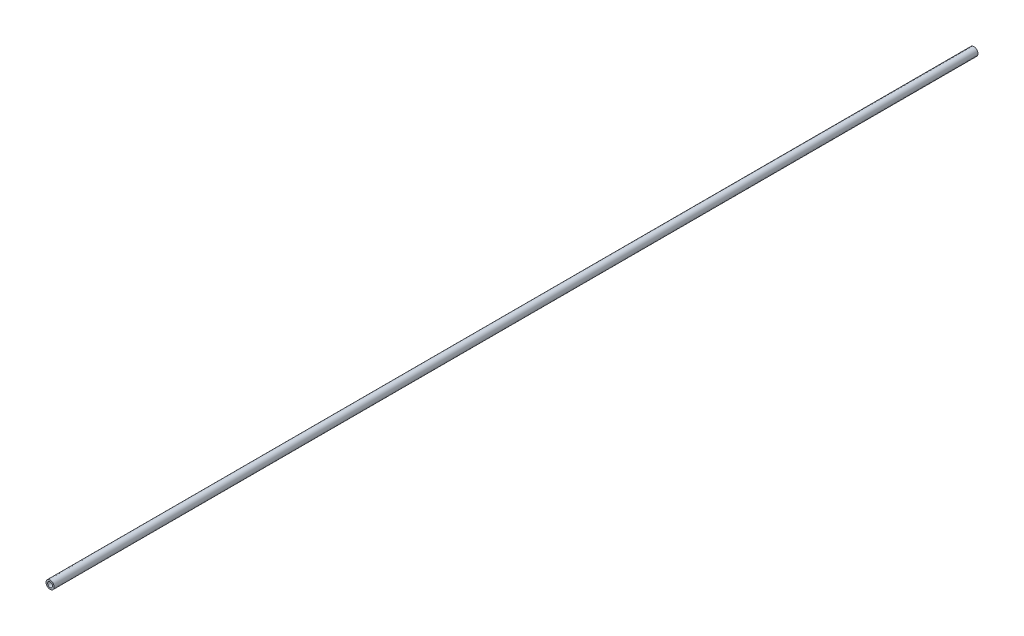
ISO-10303-21;
HEADER;
FILE_DESCRIPTION(('STEP AP214'),'2;1');
FILE_NAME('part.step','',(''),(''),'','','');
FILE_SCHEMA(('AUTOMOTIVE_DESIGN { 1 0 10303 214 1 1 1 1 }'));
ENDSEC;
DATA;
#1=APPLICATION_CONTEXT('core data for automotive mechanical design processes');
#2=APPLICATION_PROTOCOL_DEFINITION('international standard','automotive_design',2000,#1);
#3=PRODUCT_CONTEXT('',#1,'mechanical');
#4=PRODUCT('Part','Part','',(#3));
#5=PRODUCT_RELATED_PRODUCT_CATEGORY('part','',(#4));
#6=PRODUCT_DEFINITION_FORMATION('','',#4);
#7=PRODUCT_DEFINITION_CONTEXT('part definition',#1,'design');
#8=PRODUCT_DEFINITION('design','',#6,#7);
#9=PRODUCT_DEFINITION_SHAPE('','',#8);
#10=(LENGTH_UNIT() NAMED_UNIT(*) SI_UNIT(.MILLI.,.METRE.));
#11=(NAMED_UNIT(*) PLANE_ANGLE_UNIT() SI_UNIT($,.RADIAN.));
#12=(NAMED_UNIT(*) SI_UNIT($,.STERADIAN.) SOLID_ANGLE_UNIT());
#13=UNCERTAINTY_MEASURE_WITH_UNIT(LENGTH_MEASURE(1.E-05),#10,'distance_accuracy_value','');
#14=(GEOMETRIC_REPRESENTATION_CONTEXT(3) GLOBAL_UNCERTAINTY_ASSIGNED_CONTEXT((#13)) GLOBAL_UNIT_ASSIGNED_CONTEXT((#10,
#11,#12)) REPRESENTATION_CONTEXT('',''));
#15=CARTESIAN_POINT('',(0.,0.,0.));
#16=DIRECTION('',(0.,0.,1.));
#17=DIRECTION('',(1.,0.,0.));
#18=AXIS2_PLACEMENT_3D('',#15,#16,#17);
#19=CARTESIAN_POINT('',(0.,0.,2874.85670247649));
#20=DIRECTION('',(0.,0.,-1.));
#21=DIRECTION('',(-1.,0.,0.));
#22=AXIS2_PLACEMENT_3D('',#19,#20,#21);
#23=CYLINDRICAL_SURFACE('',#22,12.7);
#24=CARTESIAN_POINT('',(0.,0.,2874.85670247649));
#25=DIRECTION('',(0.,0.,1.));
#26=DIRECTION('',(1.,0.,0.));
#27=AXIS2_PLACEMENT_3D('',#24,#25,#26);
#28=CIRCLE('',#27,12.7);
#29=CARTESIAN_POINT('',(12.7,0.,2874.85670247649));
#30=VERTEX_POINT('',#29);
#31=EDGE_CURVE('E10',#30,#30,#28,.T.);
#32=ORIENTED_EDGE('',*,*,#31,.F.);
#33=EDGE_LOOP('',(#32));
#34=FACE_BOUND('',#33,.T.);
#35=CARTESIAN_POINT('',(0.,0.,0.));
#36=DIRECTION('',(0.,0.,1.));
#37=DIRECTION('',(1.,0.,0.));
#38=AXIS2_PLACEMENT_3D('',#35,#36,#37);
#39=CIRCLE('',#38,12.7);
#40=CARTESIAN_POINT('',(12.7,0.,0.));
#41=VERTEX_POINT('',#40);
#42=EDGE_CURVE('E46',#41,#41,#39,.T.);
#43=ORIENTED_EDGE('',*,*,#42,.T.);
#44=EDGE_LOOP('',(#43));
#45=FACE_BOUND('',#44,.T.);
#46=ADVANCED_FACE('F43',(#34,#45),#23,.T.);
#47=CARTESIAN_POINT('',(0.,0.,2874.85670247649));
#48=DIRECTION('',(0.,0.,1.));
#49=DIRECTION('',(1.,0.,0.));
#50=AXIS2_PLACEMENT_3D('',#47,#48,#49);
#51=PLANE('',#50);
#52=CARTESIAN_POINT('',(0.,0.,2874.85670247649));
#53=DIRECTION('',(0.,0.,-1.));
#54=DIRECTION('',(-1.,0.,0.));
#55=AXIS2_PLACEMENT_3D('',#52,#53,#54);
#56=CIRCLE('',#55,7.62);
#57=CARTESIAN_POINT('',(-7.62,0.,2874.85670247649));
#58=VERTEX_POINT('',#57);
#59=EDGE_CURVE('E53',#58,#58,#56,.T.);
#60=ORIENTED_EDGE('',*,*,#59,.T.);
#61=EDGE_LOOP('',(#60));
#62=FACE_BOUND('',#61,.T.);
#63=ORIENTED_EDGE('',*,*,#31,.T.);
#64=EDGE_LOOP('',(#63));
#65=FACE_BOUND('',#64,.T.);
#66=ADVANCED_FACE('F61',(#62,#65),#51,.T.);
#67=CARTESIAN_POINT('',(0.,0.,0.));
#68=DIRECTION('',(0.,0.,1.));
#69=DIRECTION('',(1.,0.,0.));
#70=AXIS2_PLACEMENT_3D('',#67,#68,#69);
#71=PLANE('',#70);
#72=CARTESIAN_POINT('',(0.,0.,0.));
#73=DIRECTION('',(0.,0.,-1.));
#74=DIRECTION('',(-1.,0.,0.));
#75=AXIS2_PLACEMENT_3D('',#72,#73,#74);
#76=CIRCLE('',#75,7.62);
#77=CARTESIAN_POINT('',(-7.62,0.,0.));
#78=VERTEX_POINT('',#77);
#79=EDGE_CURVE('E55',#78,#78,#76,.T.);
#80=ORIENTED_EDGE('',*,*,#79,.F.);
#81=EDGE_LOOP('',(#80));
#82=FACE_BOUND('',#81,.T.);
#83=ORIENTED_EDGE('',*,*,#42,.F.);
#84=EDGE_LOOP('',(#83));
#85=FACE_BOUND('',#84,.T.);
#86=ADVANCED_FACE('F66',(#82,#85),#71,.F.);
#87=CARTESIAN_POINT('',(0.,0.,2874.85670247649));
#88=DIRECTION('',(0.,0.,-1.));
#89=DIRECTION('',(-1.,0.,0.));
#90=AXIS2_PLACEMENT_3D('',#87,#88,#89);
#91=CYLINDRICAL_SURFACE('',#90,7.62);
#92=ORIENTED_EDGE('',*,*,#59,.F.);
#93=EDGE_LOOP('',(#92));
#94=FACE_BOUND('',#93,.T.);
#95=ORIENTED_EDGE('',*,*,#79,.T.);
#96=EDGE_LOOP('',(#95));
#97=FACE_BOUND('',#96,.T.);
#98=ADVANCED_FACE('F63',(#94,#97),#91,.F.);
#99=CLOSED_SHELL('',(#46,#66,#86,#98));
#100=MANIFOLD_SOLID_BREP('B2',#99);
#101=ADVANCED_BREP_SHAPE_REPRESENTATION('',(#18,#100),#14);
#102=SHAPE_DEFINITION_REPRESENTATION(#9,#101);
ENDSEC;
END-ISO-10303-21;
